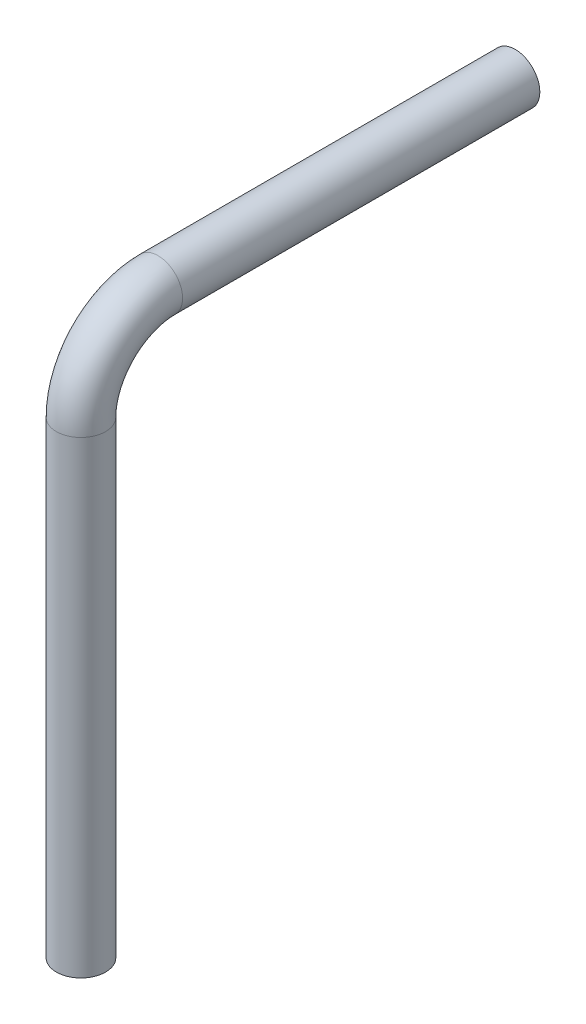
ISO-10303-21;
HEADER;
FILE_DESCRIPTION(('STEP AP214'),'2;1');
FILE_NAME('part.step','',(''),(''),'','','');
FILE_SCHEMA(('AUTOMOTIVE_DESIGN { 1 0 10303 214 1 1 1 1 }'));
ENDSEC;
DATA;
#1=APPLICATION_CONTEXT('core data for automotive mechanical design processes');
#2=APPLICATION_PROTOCOL_DEFINITION('international standard','automotive_design',2000,#1);
#3=PRODUCT_CONTEXT('',#1,'mechanical');
#4=PRODUCT('Part','Part','',(#3));
#5=PRODUCT_RELATED_PRODUCT_CATEGORY('part','',(#4));
#6=PRODUCT_DEFINITION_FORMATION('','',#4);
#7=PRODUCT_DEFINITION_CONTEXT('part definition',#1,'design');
#8=PRODUCT_DEFINITION('design','',#6,#7);
#9=PRODUCT_DEFINITION_SHAPE('','',#8);
#10=(LENGTH_UNIT() NAMED_UNIT(*) SI_UNIT(.MILLI.,.METRE.));
#11=(NAMED_UNIT(*) PLANE_ANGLE_UNIT() SI_UNIT($,.RADIAN.));
#12=(NAMED_UNIT(*) SI_UNIT($,.STERADIAN.) SOLID_ANGLE_UNIT());
#13=UNCERTAINTY_MEASURE_WITH_UNIT(LENGTH_MEASURE(1.E-05),#10,'distance_accuracy_value','');
#14=(GEOMETRIC_REPRESENTATION_CONTEXT(3) GLOBAL_UNCERTAINTY_ASSIGNED_CONTEXT((#13)) GLOBAL_UNIT_ASSIGNED_CONTEXT((#10,
#11,#12)) REPRESENTATION_CONTEXT('',''));
#15=CARTESIAN_POINT('',(0.,0.,0.));
#16=DIRECTION('',(0.,0.,1.));
#17=DIRECTION('',(1.,0.,0.));
#18=AXIS2_PLACEMENT_3D('',#15,#16,#17);
#19=CARTESIAN_POINT('',(0.,177.,-141.));
#20=DIRECTION('',(0.,0.,1.));
#21=DIRECTION('',(1.,0.,0.));
#22=AXIS2_PLACEMENT_3D('',#19,#20,#21);
#23=PLANE('',#22);
#24=CARTESIAN_POINT('',(0.,177.,-141.));
#25=DIRECTION('',(0.,0.,1.));
#26=DIRECTION('',(1.,0.,0.));
#27=AXIS2_PLACEMENT_3D('',#24,#25,#26);
#28=CIRCLE('',#27,6.);
#29=CARTESIAN_POINT('',(6.,177.,-141.));
#30=VERTEX_POINT('',#29);
#31=EDGE_CURVE('E96',#30,#30,#28,.T.);
#32=ORIENTED_EDGE('',*,*,#31,.T.);
#33=EDGE_LOOP('',(#32));
#34=FACE_BOUND('',#33,.T.);
#35=CARTESIAN_POINT('',(0.,177.,-141.));
#36=DIRECTION('',(0.,0.,1.));
#37=DIRECTION('',(1.,0.,0.));
#38=AXIS2_PLACEMENT_3D('',#35,#36,#37);
#39=CIRCLE('',#38,8.);
#40=CARTESIAN_POINT('',(8.,177.,-141.));
#41=VERTEX_POINT('',#40);
#42=EDGE_CURVE('E70',#41,#41,#39,.T.);
#43=ORIENTED_EDGE('',*,*,#42,.F.);
#44=EDGE_LOOP('',(#43));
#45=FACE_BOUND('',#44,.T.);
#46=ADVANCED_FACE('F67',(#34,#45),#23,.F.);
#47=CARTESIAN_POINT('',(0.,0.,0.));
#48=DIRECTION('',(0.,-1.,0.));
#49=DIRECTION('',(1.,0.,0.));
#50=AXIS2_PLACEMENT_3D('',#47,#48,#49);
#51=PLANE('',#50);
#52=CARTESIAN_POINT('',(0.,0.,0.));
#53=DIRECTION('',(0.,-1.,0.));
#54=DIRECTION('',(0.,0.,-1.));
#55=AXIS2_PLACEMENT_3D('',#52,#53,#54);
#56=CIRCLE('',#55,6.);
#57=CARTESIAN_POINT('',(0.,0.,6.00000000000003));
#58=VERTEX_POINT('',#57);
#59=EDGE_CURVE('E87',#58,#58,#56,.T.);
#60=ORIENTED_EDGE('',*,*,#59,.F.);
#61=EDGE_LOOP('',(#60));
#62=FACE_BOUND('',#61,.T.);
#63=CARTESIAN_POINT('',(0.,0.,0.));
#64=DIRECTION('',(0.,-1.,0.));
#65=DIRECTION('',(1.,0.,0.));
#66=AXIS2_PLACEMENT_3D('',#63,#64,#65);
#67=CIRCLE('',#66,8.);
#68=CARTESIAN_POINT('',(0.,0.,8.00000000000003));
#69=VERTEX_POINT('',#68);
#70=EDGE_CURVE('E81',#69,#69,#67,.T.);
#71=ORIENTED_EDGE('',*,*,#70,.T.);
#72=EDGE_LOOP('',(#71));
#73=FACE_BOUND('',#72,.T.);
#74=ADVANCED_FACE('F125',(#62,#73),#51,.T.);
#75=CARTESIAN_POINT('',(0.,177.,-25.));
#76=DIRECTION('',(0.,0.,-1.));
#77=DIRECTION('',(-1.,0.,0.));
#78=AXIS2_PLACEMENT_3D('',#75,#76,#77);
#79=CYLINDRICAL_SURFACE('',#78,8.);
#80=ORIENTED_EDGE('',*,*,#42,.T.);
#81=EDGE_LOOP('',(#80));
#82=FACE_BOUND('',#81,.T.);
#83=CARTESIAN_POINT('',(0.,177.,-25.));
#84=DIRECTION('',(0.,6.42331473746677E-08,0.999999999999998));
#85=DIRECTION('',(1.,0.,0.));
#86=AXIS2_PLACEMENT_3D('',#83,#84,#85);
#87=CIRCLE('',#86,8.);
#88=CARTESIAN_POINT('',(0.,185.,-25.0000005138652));
#89=VERTEX_POINT('',#88);
#90=EDGE_CURVE('E11',#89,#89,#87,.T.);
#91=ORIENTED_EDGE('',*,*,#90,.F.);
#92=EDGE_LOOP('',(#91));
#93=FACE_BOUND('',#92,.T.);
#94=ADVANCED_FACE('F126',(#82,#93),#79,.T.);
#95=CARTESIAN_POINT('',(0.,0.,0.));
#96=DIRECTION('',(0.,1.,0.));
#97=DIRECTION('',(0.,0.,1.));
#98=AXIS2_PLACEMENT_3D('',#95,#96,#97);
#99=CYLINDRICAL_SURFACE('',#98,8.);
#100=CARTESIAN_POINT('',(0.,152.000001605829,0.));
#101=DIRECTION('',(0.,-1.,0.));
#102=DIRECTION('',(1.,0.,0.));
#103=AXIS2_PLACEMENT_3D('',#100,#101,#102);
#104=CIRCLE('',#103,8.);
#105=CARTESIAN_POINT('',(0.,152.000001605829,8.00000000000003));
#106=VERTEX_POINT('',#105);
#107=EDGE_CURVE('E73',#106,#106,#104,.T.);
#108=CARTESIAN_POINT('',(0.,152.000001605829,8.00000000000003));
#109=CARTESIAN_POINT('',(0.,150.416668255768,8.00000000000003));
#110=CARTESIAN_POINT('',(0.,148.833334905707,8.00000000000003));
#111=CARTESIAN_POINT('',(0.,145.666668205586,8.00000000000003));
#112=CARTESIAN_POINT('',(0.,144.083334855525,8.00000000000003));
#113=CARTESIAN_POINT('',(0.,140.916668155404,8.00000000000003));
#114=CARTESIAN_POINT('',(0.,139.333334805343,8.00000000000003));
#115=CARTESIAN_POINT('',(0.,136.166668105221,8.00000000000003));
#116=CARTESIAN_POINT('',(0.,134.583334755161,8.00000000000003));
#117=CARTESIAN_POINT('',(0.,131.416668055039,8.00000000000003));
#118=CARTESIAN_POINT('',(0.,129.833334704979,8.00000000000003));
#119=CARTESIAN_POINT('',(0.,126.666668004857,8.00000000000003));
#120=CARTESIAN_POINT('',(0.,125.083334654796,8.00000000000003));
#121=CARTESIAN_POINT('',(0.,121.916667954675,8.00000000000003));
#122=CARTESIAN_POINT('',(0.,120.333334604614,8.00000000000003));
#123=CARTESIAN_POINT('',(0.,117.166667904493,8.00000000000003));
#124=CARTESIAN_POINT('',(0.,115.583334554432,8.00000000000003));
#125=CARTESIAN_POINT('',(0.,112.416667854311,8.00000000000003));
#126=CARTESIAN_POINT('',(0.,110.83333450425,8.00000000000003));
#127=CARTESIAN_POINT('',(0.,107.666667804129,8.00000000000003));
#128=CARTESIAN_POINT('',(0.,106.083334454068,8.00000000000003));
#129=CARTESIAN_POINT('',(0.,102.916667753946,8.00000000000003));
#130=CARTESIAN_POINT('',(0.,101.333334403886,8.00000000000003));
#131=CARTESIAN_POINT('',(0.,98.1666677037643,8.00000000000003));
#132=CARTESIAN_POINT('',(0.,96.5833343537035,8.00000000000003));
#133=CARTESIAN_POINT('',(0.,93.4166676535821,8.00000000000003));
#134=CARTESIAN_POINT('',(0.,91.8333343035214,8.00000000000003));
#135=CARTESIAN_POINT('',(0.,88.6666676034,8.00000000000003));
#136=CARTESIAN_POINT('',(0.,87.0833342533393,8.00000000000003));
#137=CARTESIAN_POINT('',(0.,83.9166675532178,8.00000000000003));
#138=CARTESIAN_POINT('',(0.,82.3333342031571,8.00000000000003));
#139=CARTESIAN_POINT('',(0.,79.1666675030357,8.00000000000003));
#140=CARTESIAN_POINT('',(0.,77.583334152975,8.00000000000003));
#141=CARTESIAN_POINT('',(0.,74.4166674528536,8.00000000000003));
#142=CARTESIAN_POINT('',(0.,72.8333341027928,8.00000000000003));
#143=CARTESIAN_POINT('',(0.,69.6666674026714,8.00000000000003));
#144=CARTESIAN_POINT('',(0.,68.0833340526107,8.00000000000003));
#145=CARTESIAN_POINT('',(0.,64.9166673524893,8.00000000000003));
#146=CARTESIAN_POINT('',(0.,63.3333340024286,8.00000000000003));
#147=CARTESIAN_POINT('',(0.,60.1666673023071,8.00000000000003));
#148=CARTESIAN_POINT('',(0.,58.5833339522464,8.00000000000003));
#149=CARTESIAN_POINT('',(0.,55.416667252125,8.00000000000003));
#150=CARTESIAN_POINT('',(0.,53.8333339020643,8.00000000000003));
#151=CARTESIAN_POINT('',(0.,50.6666672019428,8.00000000000003));
#152=CARTESIAN_POINT('',(0.,49.0833338518821,8.00000000000003));
#153=CARTESIAN_POINT('',(0.,45.9166671517607,8.00000000000003));
#154=CARTESIAN_POINT('',(0.,44.3333338017,8.00000000000003));
#155=CARTESIAN_POINT('',(0.,41.1666671015786,8.00000000000003));
#156=CARTESIAN_POINT('',(0.,39.5833337515179,8.00000000000003));
#157=CARTESIAN_POINT('',(0.,36.4166670513964,8.00000000000003));
#158=CARTESIAN_POINT('',(0.,34.8333337013357,8.00000000000003));
#159=CARTESIAN_POINT('',(0.,31.6666670012143,8.00000000000003));
#160=CARTESIAN_POINT('',(0.,30.0833336511536,8.00000000000003));
#161=CARTESIAN_POINT('',(0.,26.9166669510321,8.00000000000003));
#162=CARTESIAN_POINT('',(0.,25.3333336009714,8.00000000000003));
#163=CARTESIAN_POINT('',(0.,22.16666690085,8.00000000000003));
#164=CARTESIAN_POINT('',(0.,20.5833335507893,8.00000000000003));
#165=CARTESIAN_POINT('',(0.,17.4166668506678,8.00000000000003));
#166=CARTESIAN_POINT('',(0.,15.8333335006071,8.00000000000003));
#167=CARTESIAN_POINT('',(0.,12.6666668004857,8.00000000000003));
#168=CARTESIAN_POINT('',(0.,11.083333450425,8.00000000000003));
#169=CARTESIAN_POINT('',(0.,7.91666675030357,8.00000000000003));
#170=CARTESIAN_POINT('',(0.,6.33333340024285,8.00000000000003));
#171=CARTESIAN_POINT('',(0.,3.16666670012143,8.00000000000003));
#172=CARTESIAN_POINT('',(0.,1.58333335006071,8.00000000000003));
#173=CARTESIAN_POINT('',(0.,0.,8.00000000000003));
#174=B_SPLINE_CURVE_WITH_KNOTS('',3,(#108,#109,#110,#111,#112,#113,#114,#115,#116,#117,#118,
#119,#120,#121,#122,#123,#124,#125,#126,#127,#128,#129,#130,#131,#132,#133,#134,#135,#136,#137,
#138,#139,#140,#141,#142,#143,#144,#145,#146,#147,#148,#149,#150,#151,#152,#153,#154,#155,#156,
#157,#158,#159,#160,#161,#162,#163,#164,#165,#166,#167,#168,#169,#170,#171,#172,#173),
.UNSPECIFIED.,.F.,.F.,(4,2,2,2,2,2,2,2,2,2,2,2,2,2,2,2,2,2,2,2,2,2,2,2,2,2,2,2,2,2,2,2,4),(0.,
4.75000005018214,9.50000010036428,14.2500001505464,19.0000002007286,23.7500002509107,
28.5000003010929,33.250000351275,38.0000004014571,42.7500004516393,47.5000005018214,
52.2500005520036,57.0000006021857,61.7500006523679,66.50000070255,71.2500007527321,
76.0000008029143,80.7500008530964,85.5000009032786,90.2500009534607,95.0000010036428,
99.750001053825,104.500001104007,109.250001154189,114.000001204371,118.750001254554,
123.500001304736,128.250001354918,133.0000014051,137.750001455282,142.500001505464,
147.250001555646,152.000001605829),.UNSPECIFIED.);
#175=EDGE_CURVE('BSEAM132',#106,#69,#174,.T.);
#176=ORIENTED_EDGE('',*,*,#107,.T.);
#177=ORIENTED_EDGE('',*,*,#70,.F.);
#178=ORIENTED_EDGE('',*,*,#175,.T.);
#179=ORIENTED_EDGE('',*,*,#175,.F.);
#180=EDGE_LOOP('',(#176,#178,#177,#179));
#181=FACE_BOUND('',#180,.T.);
#182=ADVANCED_FACE('F132',(#181),#99,.T.);
#183=CARTESIAN_POINT('',(0.,152.000001605829,-24.9999983941714));
#184=DIRECTION('',(-1.,0.,0.));
#185=DIRECTION('',(0.,0.,1.));
#186=AXIS2_PLACEMENT_3D('',#183,#184,#185);
#187=TOROIDAL_SURFACE('',#186,24.9999983941715,8.);
#188=CARTESIAN_POINT('',(0.,152.000001605829,-24.9999983941714));
#189=DIRECTION('',(-1.,0.,0.));
#190=DIRECTION('',(0.,0.,1.));
#191=AXIS2_PLACEMENT_3D('',#188,#189,#190);
#192=CIRCLE('',#191,32.9999983941715);
#193=EDGE_CURVE('',#106,#89,#192,.T.);
#194=ORIENTED_EDGE('',*,*,#107,.F.);
#195=ORIENTED_EDGE('',*,*,#90,.T.);
#196=ORIENTED_EDGE('',*,*,#193,.T.);
#197=ORIENTED_EDGE('',*,*,#193,.F.);
#198=EDGE_LOOP('',(#194,#196,#195,#197));
#199=FACE_BOUND('',#198,.T.);
#200=ADVANCED_FACE('F121',(#199),#187,.T.);
#201=CARTESIAN_POINT('',(0.,-4.99999999999998,0.));
#202=DIRECTION('',(0.,1.,0.));
#203=DIRECTION('',(0.,0.,1.));
#204=AXIS2_PLACEMENT_3D('',#201,#202,#203);
#205=CYLINDRICAL_SURFACE('',#204,6.);
#206=CARTESIAN_POINT('',(0.,152.000001605829,0.));
#207=DIRECTION('',(0.,-1.,0.));
#208=DIRECTION('',(1.,0.,0.));
#209=AXIS2_PLACEMENT_3D('',#206,#207,#208);
#210=CIRCLE('',#209,6.);
#211=CARTESIAN_POINT('',(0.,152.000001605829,6.00000000000003));
#212=VERTEX_POINT('',#211);
#213=EDGE_CURVE('E95',#212,#212,#210,.T.);
#214=CARTESIAN_POINT('',(0.,152.000001605829,6.00000000000003));
#215=CARTESIAN_POINT('',(0.,150.416668255768,6.00000000000003));
#216=CARTESIAN_POINT('',(0.,148.833334905707,6.00000000000003));
#217=CARTESIAN_POINT('',(0.,145.666668205586,6.00000000000003));
#218=CARTESIAN_POINT('',(0.,144.083334855525,6.00000000000003));
#219=CARTESIAN_POINT('',(0.,140.916668155404,6.00000000000003));
#220=CARTESIAN_POINT('',(0.,139.333334805343,6.00000000000003));
#221=CARTESIAN_POINT('',(0.,136.166668105221,6.00000000000003));
#222=CARTESIAN_POINT('',(0.,134.583334755161,6.00000000000003));
#223=CARTESIAN_POINT('',(0.,131.416668055039,6.00000000000003));
#224=CARTESIAN_POINT('',(0.,129.833334704979,6.00000000000003));
#225=CARTESIAN_POINT('',(0.,126.666668004857,6.00000000000003));
#226=CARTESIAN_POINT('',(0.,125.083334654796,6.00000000000003));
#227=CARTESIAN_POINT('',(0.,121.916667954675,6.00000000000003));
#228=CARTESIAN_POINT('',(0.,120.333334604614,6.00000000000003));
#229=CARTESIAN_POINT('',(0.,117.166667904493,6.00000000000003));
#230=CARTESIAN_POINT('',(0.,115.583334554432,6.00000000000003));
#231=CARTESIAN_POINT('',(0.,112.416667854311,6.00000000000003));
#232=CARTESIAN_POINT('',(0.,110.83333450425,6.00000000000003));
#233=CARTESIAN_POINT('',(0.,107.666667804129,6.00000000000003));
#234=CARTESIAN_POINT('',(0.,106.083334454068,6.00000000000003));
#235=CARTESIAN_POINT('',(0.,102.916667753946,6.00000000000003));
#236=CARTESIAN_POINT('',(0.,101.333334403886,6.00000000000003));
#237=CARTESIAN_POINT('',(0.,98.1666677037643,6.00000000000003));
#238=CARTESIAN_POINT('',(0.,96.5833343537036,6.00000000000003));
#239=CARTESIAN_POINT('',(0.,93.4166676535822,6.00000000000003));
#240=CARTESIAN_POINT('',(0.,91.8333343035214,6.00000000000003));
#241=CARTESIAN_POINT('',(0.,88.6666676034,6.00000000000003));
#242=CARTESIAN_POINT('',(0.,87.0833342533393,6.00000000000003));
#243=CARTESIAN_POINT('',(0.,83.9166675532179,6.00000000000003));
#244=CARTESIAN_POINT('',(0.,82.3333342031571,6.00000000000003));
#245=CARTESIAN_POINT('',(0.,79.1666675030357,6.00000000000003));
#246=CARTESIAN_POINT('',(0.,77.583334152975,6.00000000000003));
#247=CARTESIAN_POINT('',(0.,74.4166674528536,6.00000000000003));
#248=CARTESIAN_POINT('',(0.,72.8333341027929,6.00000000000003));
#249=CARTESIAN_POINT('',(0.,69.6666674026714,6.00000000000003));
#250=CARTESIAN_POINT('',(0.,68.0833340526107,6.00000000000003));
#251=CARTESIAN_POINT('',(0.,64.9166673524893,6.00000000000003));
#252=CARTESIAN_POINT('',(0.,63.3333340024286,6.00000000000003));
#253=CARTESIAN_POINT('',(0.,60.1666673023071,6.00000000000003));
#254=CARTESIAN_POINT('',(0.,58.5833339522464,6.00000000000003));
#255=CARTESIAN_POINT('',(0.,55.416667252125,6.00000000000003));
#256=CARTESIAN_POINT('',(0.,53.8333339020643,6.00000000000003));
#257=CARTESIAN_POINT('',(0.,50.6666672019429,6.00000000000003));
#258=CARTESIAN_POINT('',(0.,49.0833338518821,6.00000000000003));
#259=CARTESIAN_POINT('',(0.,45.9166671517607,6.00000000000003));
#260=CARTESIAN_POINT('',(0.,44.3333338017,6.00000000000003));
#261=CARTESIAN_POINT('',(0.,41.1666671015786,6.00000000000003));
#262=CARTESIAN_POINT('',(0.,39.5833337515179,6.00000000000003));
#263=CARTESIAN_POINT('',(0.,36.4166670513964,6.00000000000003));
#264=CARTESIAN_POINT('',(0.,34.8333337013357,6.00000000000003));
#265=CARTESIAN_POINT('',(0.,31.6666670012143,6.00000000000003));
#266=CARTESIAN_POINT('',(0.,30.0833336511536,6.00000000000003));
#267=CARTESIAN_POINT('',(0.,26.9166669510321,6.00000000000003));
#268=CARTESIAN_POINT('',(0.,25.3333336009714,6.00000000000003));
#269=CARTESIAN_POINT('',(0.,22.16666690085,6.00000000000003));
#270=CARTESIAN_POINT('',(0.,20.5833335507893,6.00000000000003));
#271=CARTESIAN_POINT('',(0.,17.4166668506678,6.00000000000003));
#272=CARTESIAN_POINT('',(0.,15.8333335006071,6.00000000000003));
#273=CARTESIAN_POINT('',(0.,12.6666668004857,6.00000000000003));
#274=CARTESIAN_POINT('',(0.,11.083333450425,6.00000000000003));
#275=CARTESIAN_POINT('',(0.,7.91666675030357,6.00000000000003));
#276=CARTESIAN_POINT('',(0.,6.33333340024285,6.00000000000003));
#277=CARTESIAN_POINT('',(0.,3.16666670012143,6.00000000000003));
#278=CARTESIAN_POINT('',(0.,1.58333335006071,6.00000000000003));
#279=CARTESIAN_POINT('',(0.,0.,6.00000000000003));
#280=B_SPLINE_CURVE_WITH_KNOTS('',3,(#214,#215,#216,#217,#218,#219,#220,#221,#222,#223,#224,
#225,#226,#227,#228,#229,#230,#231,#232,#233,#234,#235,#236,#237,#238,#239,#240,#241,#242,#243,
#244,#245,#246,#247,#248,#249,#250,#251,#252,#253,#254,#255,#256,#257,#258,#259,#260,#261,#262,
#263,#264,#265,#266,#267,#268,#269,#270,#271,#272,#273,#274,#275,#276,#277,#278,#279),
.UNSPECIFIED.,.F.,.F.,(4,2,2,2,2,2,2,2,2,2,2,2,2,2,2,2,2,2,2,2,2,2,2,2,2,2,2,2,2,2,2,2,4),(0.,
4.75000005018214,9.50000010036428,14.2500001505464,19.0000002007286,23.7500002509107,
28.5000003010928,33.250000351275,38.0000004014572,42.7500004516393,47.5000005018214,
52.2500005520036,57.0000006021857,61.7500006523679,66.50000070255,71.2500007527321,
76.0000008029143,80.7500008530964,85.5000009032786,90.2500009534607,95.0000010036429,
99.750001053825,104.500001104007,109.250001154189,114.000001204371,118.750001254554,
123.500001304736,128.250001354918,133.0000014051,137.750001455282,142.500001505464,
147.250001555646,152.000001605829),.UNSPECIFIED.);
#281=EDGE_CURVE('BSEAM109',#212,#58,#280,.T.);
#282=ORIENTED_EDGE('',*,*,#213,.F.);
#283=ORIENTED_EDGE('',*,*,#59,.T.);
#284=ORIENTED_EDGE('',*,*,#281,.T.);
#285=ORIENTED_EDGE('',*,*,#281,.F.);
#286=EDGE_LOOP('',(#282,#284,#283,#285));
#287=FACE_BOUND('',#286,.T.);
#288=ADVANCED_FACE('F109',(#287),#205,.F.);
#289=CARTESIAN_POINT('',(0.,177.,-25.));
#290=DIRECTION('',(0.,0.,-1.));
#291=DIRECTION('',(-1.,0.,0.));
#292=AXIS2_PLACEMENT_3D('',#289,#290,#291);
#293=CYLINDRICAL_SURFACE('',#292,6.);
#294=ORIENTED_EDGE('',*,*,#31,.F.);
#295=EDGE_LOOP('',(#294));
#296=FACE_BOUND('',#295,.T.);
#297=CARTESIAN_POINT('',(0.,177.,-25.));
#298=DIRECTION('',(0.,6.42331473746677E-08,0.999999999999998));
#299=DIRECTION('',(1.,0.,0.));
#300=AXIS2_PLACEMENT_3D('',#297,#298,#299);
#301=CIRCLE('',#300,6.);
#302=CARTESIAN_POINT('',(0.,183.,-25.0000003853989));
#303=VERTEX_POINT('',#302);
#304=EDGE_CURVE('E93',#303,#303,#301,.T.);
#305=ORIENTED_EDGE('',*,*,#304,.T.);
#306=EDGE_LOOP('',(#305));
#307=FACE_BOUND('',#306,.T.);
#308=ADVANCED_FACE('F106',(#296,#307),#293,.F.);
#309=CARTESIAN_POINT('',(0.,152.000001605829,-24.9999983941714));
#310=DIRECTION('',(-1.,0.,0.));
#311=DIRECTION('',(0.,0.,1.));
#312=AXIS2_PLACEMENT_3D('',#309,#310,#311);
#313=TOROIDAL_SURFACE('',#312,24.9999983941715,6.);
#314=CARTESIAN_POINT('',(0.,152.000001605829,-24.9999983941714));
#315=DIRECTION('',(-1.,0.,0.));
#316=DIRECTION('',(0.,0.,1.));
#317=AXIS2_PLACEMENT_3D('',#314,#315,#316);
#318=CIRCLE('',#317,30.9999983941715);
#319=EDGE_CURVE('',#212,#303,#318,.T.);
#320=ORIENTED_EDGE('',*,*,#213,.T.);
#321=ORIENTED_EDGE('',*,*,#304,.F.);
#322=ORIENTED_EDGE('',*,*,#319,.T.);
#323=ORIENTED_EDGE('',*,*,#319,.F.);
#324=EDGE_LOOP('',(#320,#322,#321,#323));
#325=FACE_BOUND('',#324,.T.);
#326=ADVANCED_FACE('F108',(#325),#313,.F.);
#327=CLOSED_SHELL('',(#46,#74,#94,#182,#200,#288,#308,#326));
#328=MANIFOLD_SOLID_BREP('B2',#327);
#329=ADVANCED_BREP_SHAPE_REPRESENTATION('',(#18,#328),#14);
#330=SHAPE_DEFINITION_REPRESENTATION(#9,#329);
ENDSEC;
END-ISO-10303-21;
